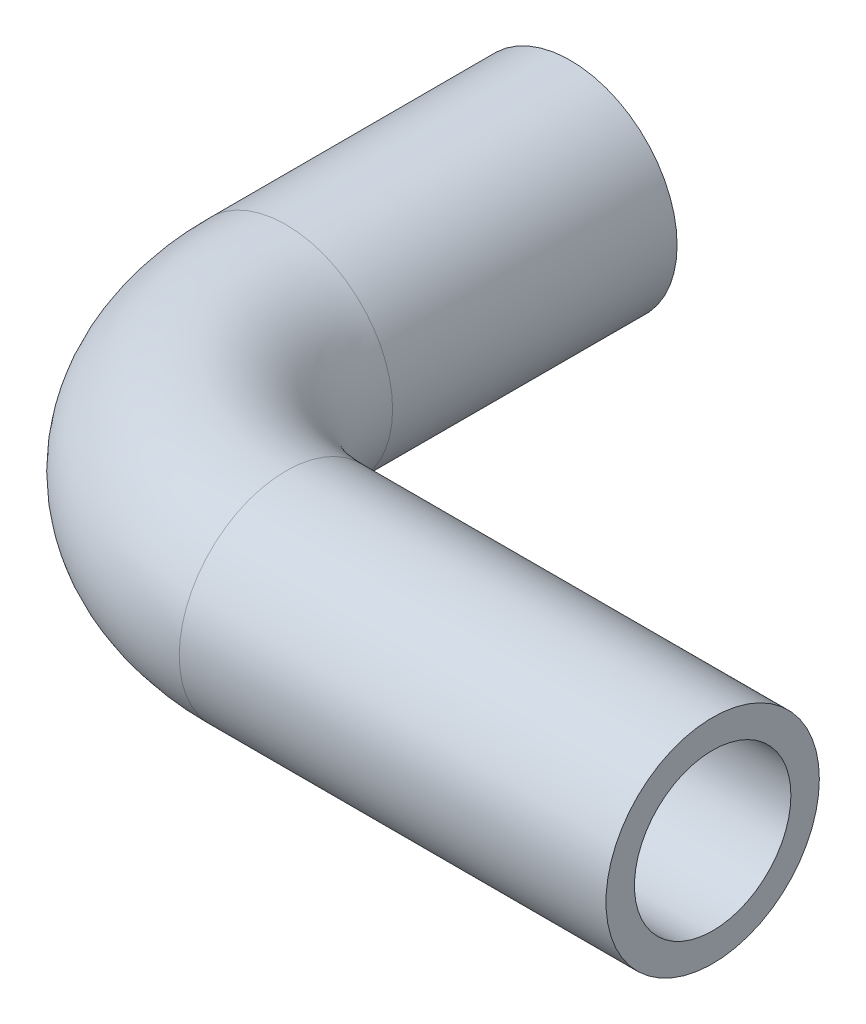
ISO-10303-21;
HEADER;
FILE_DESCRIPTION(('STEP AP214'),'2;1');
FILE_NAME('part.step','',(''),(''),'','','');
FILE_SCHEMA(('AUTOMOTIVE_DESIGN { 1 0 10303 214 1 1 1 1 }'));
ENDSEC;
DATA;
#1=APPLICATION_CONTEXT('core data for automotive mechanical design processes');
#2=APPLICATION_PROTOCOL_DEFINITION('international standard','automotive_design',2000,#1);
#3=PRODUCT_CONTEXT('',#1,'mechanical');
#4=PRODUCT('Part','Part','',(#3));
#5=PRODUCT_RELATED_PRODUCT_CATEGORY('part','',(#4));
#6=PRODUCT_DEFINITION_FORMATION('','',#4);
#7=PRODUCT_DEFINITION_CONTEXT('part definition',#1,'design');
#8=PRODUCT_DEFINITION('design','',#6,#7);
#9=PRODUCT_DEFINITION_SHAPE('','',#8);
#10=(LENGTH_UNIT() NAMED_UNIT(*) SI_UNIT(.MILLI.,.METRE.));
#11=(NAMED_UNIT(*) PLANE_ANGLE_UNIT() SI_UNIT($,.RADIAN.));
#12=(NAMED_UNIT(*) SI_UNIT($,.STERADIAN.) SOLID_ANGLE_UNIT());
#13=UNCERTAINTY_MEASURE_WITH_UNIT(LENGTH_MEASURE(1.E-05),#10,'distance_accuracy_value','');
#14=(GEOMETRIC_REPRESENTATION_CONTEXT(3) GLOBAL_UNCERTAINTY_ASSIGNED_CONTEXT((#13)) GLOBAL_UNIT_ASSIGNED_CONTEXT((#10,
#11,#12)) REPRESENTATION_CONTEXT('',''));
#15=CARTESIAN_POINT('',(0.,0.,0.));
#16=DIRECTION('',(0.,0.,1.));
#17=DIRECTION('',(1.,0.,0.));
#18=AXIS2_PLACEMENT_3D('',#15,#16,#17);
#19=CARTESIAN_POINT('',(-75.,0.,-175.));
#20=DIRECTION('',(0.,0.,1.));
#21=DIRECTION('',(1.,0.,0.));
#22=AXIS2_PLACEMENT_3D('',#19,#20,#21);
#23=PLANE('',#22);
#24=CARTESIAN_POINT('',(-75.,0.,-175.));
#25=DIRECTION('',(0.,0.,-1.));
#26=DIRECTION('',(-1.,0.,0.));
#27=AXIS2_PLACEMENT_3D('',#24,#25,#26);
#28=CIRCLE('',#27,27.5);
#29=CARTESIAN_POINT('',(-102.5,0.,-175.));
#30=VERTEX_POINT('',#29);
#31=EDGE_CURVE('E91',#30,#30,#28,.T.);
#32=ORIENTED_EDGE('',*,*,#31,.F.);
#33=EDGE_LOOP('',(#32));
#34=FACE_BOUND('',#33,.T.);
#35=CARTESIAN_POINT('',(-75.,0.,-175.));
#36=DIRECTION('',(0.,0.,1.));
#37=DIRECTION('',(1.,0.,0.));
#38=AXIS2_PLACEMENT_3D('',#35,#36,#37);
#39=CIRCLE('',#38,37.5);
#40=CARTESIAN_POINT('',(-37.5,0.,-175.));
#41=VERTEX_POINT('',#40);
#42=EDGE_CURVE('E73',#41,#41,#39,.T.);
#43=ORIENTED_EDGE('',*,*,#42,.F.);
#44=EDGE_LOOP('',(#43));
#45=FACE_BOUND('',#44,.T.);
#46=ADVANCED_FACE('F56',(#34,#45),#23,.F.);
#47=CARTESIAN_POINT('',(150.,0.,0.));
#48=DIRECTION('',(1.,0.,0.));
#49=DIRECTION('',(0.,0.,-1.));
#50=AXIS2_PLACEMENT_3D('',#47,#48,#49);
#51=PLANE('',#50);
#52=CARTESIAN_POINT('',(150.,0.,0.));
#53=DIRECTION('',(1.,0.,0.));
#54=DIRECTION('',(0.,0.,-1.));
#55=AXIS2_PLACEMENT_3D('',#52,#53,#54);
#56=CIRCLE('',#55,27.5);
#57=CARTESIAN_POINT('',(150.,0.,-27.5));
#58=VERTEX_POINT('',#57);
#59=EDGE_CURVE('E79',#58,#58,#56,.T.);
#60=ORIENTED_EDGE('',*,*,#59,.F.);
#61=EDGE_LOOP('',(#60));
#62=FACE_BOUND('',#61,.T.);
#63=CARTESIAN_POINT('',(150.,0.,0.));
#64=DIRECTION('',(1.,0.,0.));
#65=DIRECTION('',(0.,0.,-1.));
#66=AXIS2_PLACEMENT_3D('',#63,#64,#65);
#67=CIRCLE('',#66,37.5);
#68=CARTESIAN_POINT('',(150.,0.,-37.5));
#69=VERTEX_POINT('',#68);
#70=EDGE_CURVE('E11',#69,#69,#67,.T.);
#71=ORIENTED_EDGE('',*,*,#70,.T.);
#72=EDGE_LOOP('',(#71));
#73=FACE_BOUND('',#72,.T.);
#74=ADVANCED_FACE('F100',(#62,#73),#51,.T.);
#75=CARTESIAN_POINT('',(-75.,0.,-175.));
#76=DIRECTION('',(0.,0.,1.));
#77=DIRECTION('',(1.,0.,0.));
#78=AXIS2_PLACEMENT_3D('',#75,#76,#77);
#79=CYLINDRICAL_SURFACE('',#78,37.5);
#80=CARTESIAN_POINT('',(-75.,0.,-75.));
#81=DIRECTION('',(0.,0.,1.));
#82=DIRECTION('',(1.,0.,0.));
#83=AXIS2_PLACEMENT_3D('',#80,#81,#82);
#84=CIRCLE('',#83,37.5);
#85=CARTESIAN_POINT('',(-112.5,0.,-75.0000000000001));
#86=VERTEX_POINT('',#85);
#87=EDGE_CURVE('E68',#86,#86,#84,.T.);
#88=ORIENTED_EDGE('',*,*,#87,.F.);
#89=EDGE_LOOP('',(#88));
#90=FACE_BOUND('',#89,.T.);
#91=ORIENTED_EDGE('',*,*,#42,.T.);
#92=EDGE_LOOP('',(#91));
#93=FACE_BOUND('',#92,.T.);
#94=ADVANCED_FACE('F104',(#90,#93),#79,.T.);
#95=CARTESIAN_POINT('',(0.,0.,-75.));
#96=DIRECTION('',(0.,1.,0.));
#97=DIRECTION('',(0.,0.,1.));
#98=AXIS2_PLACEMENT_3D('',#95,#96,#97);
#99=TOROIDAL_SURFACE('',#98,75.0000000000001,37.5);
#100=CARTESIAN_POINT('',(0.,0.,0.));
#101=DIRECTION('',(1.,0.,0.));
#102=DIRECTION('',(0.,0.,-1.));
#103=AXIS2_PLACEMENT_3D('',#100,#101,#102);
#104=CIRCLE('',#103,37.5);
#105=CARTESIAN_POINT('',(0.,0.,37.5));
#106=VERTEX_POINT('',#105);
#107=EDGE_CURVE('E63',#106,#106,#104,.T.);
#108=CARTESIAN_POINT('',(0.,0.,-75.));
#109=DIRECTION('',(0.,1.,0.));
#110=DIRECTION('',(0.,0.,1.));
#111=AXIS2_PLACEMENT_3D('',#108,#109,#110);
#112=CIRCLE('',#111,112.5);
#113=EDGE_CURVE('',#86,#106,#112,.T.);
#114=ORIENTED_EDGE('',*,*,#87,.T.);
#115=ORIENTED_EDGE('',*,*,#107,.F.);
#116=ORIENTED_EDGE('',*,*,#113,.T.);
#117=ORIENTED_EDGE('',*,*,#113,.F.);
#118=EDGE_LOOP('',(#114,#116,#115,#117));
#119=FACE_BOUND('',#118,.T.);
#120=ADVANCED_FACE('F106',(#119),#99,.T.);
#121=CARTESIAN_POINT('',(0.,0.,0.));
#122=DIRECTION('',(1.,0.,0.));
#123=DIRECTION('',(0.,0.,-1.));
#124=AXIS2_PLACEMENT_3D('',#121,#122,#123);
#125=CYLINDRICAL_SURFACE('',#124,37.5);
#126=ORIENTED_EDGE('',*,*,#70,.F.);
#127=EDGE_LOOP('',(#126));
#128=FACE_BOUND('',#127,.T.);
#129=ORIENTED_EDGE('',*,*,#107,.T.);
#130=EDGE_LOOP('',(#129));
#131=FACE_BOUND('',#130,.T.);
#132=ADVANCED_FACE('F113',(#128,#131),#125,.T.);
#133=CARTESIAN_POINT('',(-75.,0.,-175.));
#134=DIRECTION('',(0.,0.,1.));
#135=DIRECTION('',(1.,0.,0.));
#136=AXIS2_PLACEMENT_3D('',#133,#134,#135);
#137=CYLINDRICAL_SURFACE('',#136,27.5);
#138=CARTESIAN_POINT('',(-75.0000000000001,0.,-75.));
#139=DIRECTION('',(0.,0.,-1.));
#140=DIRECTION('',(-1.,0.,0.));
#141=AXIS2_PLACEMENT_3D('',#138,#139,#140);
#142=CIRCLE('',#141,27.5);
#143=CARTESIAN_POINT('',(-102.5,0.,-75.));
#144=VERTEX_POINT('',#143);
#145=EDGE_CURVE('E87',#144,#144,#142,.F.);
#146=ORIENTED_EDGE('',*,*,#145,.T.);
#147=EDGE_LOOP('',(#146));
#148=FACE_BOUND('',#147,.T.);
#149=ORIENTED_EDGE('',*,*,#31,.T.);
#150=EDGE_LOOP('',(#149));
#151=FACE_BOUND('',#150,.T.);
#152=ADVANCED_FACE('F96',(#148,#151),#137,.F.);
#153=CARTESIAN_POINT('',(0.,0.,-75.));
#154=DIRECTION('',(0.,1.,0.));
#155=DIRECTION('',(0.,0.,1.));
#156=AXIS2_PLACEMENT_3D('',#153,#154,#155);
#157=TOROIDAL_SURFACE('',#156,75.0000000000001,27.5);
#158=CARTESIAN_POINT('',(0.,0.,0.));
#159=DIRECTION('',(1.,0.,0.));
#160=DIRECTION('',(0.,0.,-1.));
#161=AXIS2_PLACEMENT_3D('',#158,#159,#160);
#162=CIRCLE('',#161,27.5);
#163=CARTESIAN_POINT('',(0.,0.,27.5000000000001));
#164=VERTEX_POINT('',#163);
#165=EDGE_CURVE('E83',#164,#164,#162,.T.);
#166=CARTESIAN_POINT('',(0.,0.,-75.));
#167=DIRECTION('',(0.,1.,0.));
#168=DIRECTION('',(0.,0.,1.));
#169=AXIS2_PLACEMENT_3D('',#166,#167,#168);
#170=CIRCLE('',#169,102.5);
#171=EDGE_CURVE('',#144,#164,#170,.T.);
#172=ORIENTED_EDGE('',*,*,#145,.F.);
#173=ORIENTED_EDGE('',*,*,#165,.T.);
#174=ORIENTED_EDGE('',*,*,#171,.T.);
#175=ORIENTED_EDGE('',*,*,#171,.F.);
#176=EDGE_LOOP('',(#172,#174,#173,#175));
#177=FACE_BOUND('',#176,.T.);
#178=ADVANCED_FACE('F123',(#177),#157,.F.);
#179=CARTESIAN_POINT('',(0.,0.,0.));
#180=DIRECTION('',(1.,0.,0.));
#181=DIRECTION('',(0.,0.,-1.));
#182=AXIS2_PLACEMENT_3D('',#179,#180,#181);
#183=CYLINDRICAL_SURFACE('',#182,27.5);
#184=ORIENTED_EDGE('',*,*,#59,.T.);
#185=EDGE_LOOP('',(#184));
#186=FACE_BOUND('',#185,.T.);
#187=ORIENTED_EDGE('',*,*,#165,.F.);
#188=EDGE_LOOP('',(#187));
#189=FACE_BOUND('',#188,.T.);
#190=ADVANCED_FACE('F101',(#186,#189),#183,.F.);
#191=CLOSED_SHELL('',(#46,#74,#94,#120,#132,#152,#178,#190));
#192=MANIFOLD_SOLID_BREP('B2',#191);
#193=ADVANCED_BREP_SHAPE_REPRESENTATION('',(#18,#192),#14);
#194=SHAPE_DEFINITION_REPRESENTATION(#9,#193);
ENDSEC;
END-ISO-10303-21;
